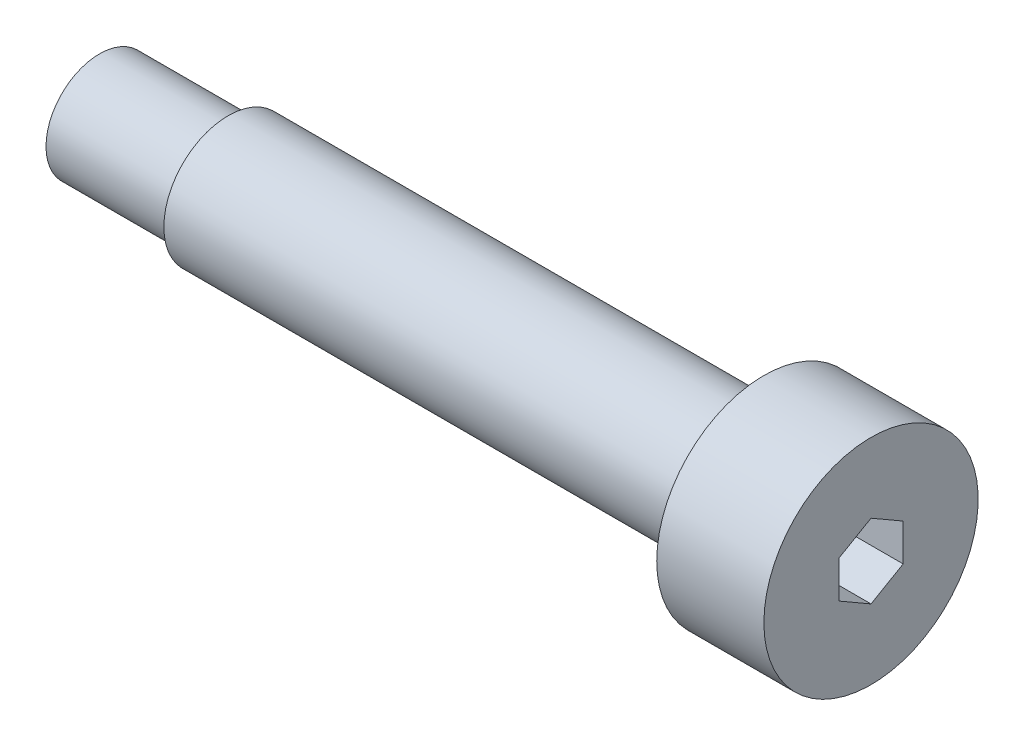
ISO-10303-21;
HEADER;
FILE_DESCRIPTION(('STEP AP214'),'2;1');
FILE_NAME('part.step','',(''),(''),'','','');
FILE_SCHEMA(('AUTOMOTIVE_DESIGN { 1 0 10303 214 1 1 1 1 }'));
ENDSEC;
DATA;
#1=APPLICATION_CONTEXT('core data for automotive mechanical design processes');
#2=APPLICATION_PROTOCOL_DEFINITION('international standard','automotive_design',2000,#1);
#3=PRODUCT_CONTEXT('',#1,'mechanical');
#4=PRODUCT('Part','Part','',(#3));
#5=PRODUCT_RELATED_PRODUCT_CATEGORY('part','',(#4));
#6=PRODUCT_DEFINITION_FORMATION('','',#4);
#7=PRODUCT_DEFINITION_CONTEXT('part definition',#1,'design');
#8=PRODUCT_DEFINITION('design','',#6,#7);
#9=PRODUCT_DEFINITION_SHAPE('','',#8);
#10=(LENGTH_UNIT() NAMED_UNIT(*) SI_UNIT(.MILLI.,.METRE.));
#11=(NAMED_UNIT(*) PLANE_ANGLE_UNIT() SI_UNIT($,.RADIAN.));
#12=(NAMED_UNIT(*) SI_UNIT($,.STERADIAN.) SOLID_ANGLE_UNIT());
#13=UNCERTAINTY_MEASURE_WITH_UNIT(LENGTH_MEASURE(1.E-05),#10,'distance_accuracy_value','');
#14=(GEOMETRIC_REPRESENTATION_CONTEXT(3) GLOBAL_UNCERTAINTY_ASSIGNED_CONTEXT((#13)) GLOBAL_UNIT_ASSIGNED_CONTEXT((#10,
#11,#12)) REPRESENTATION_CONTEXT('',''));
#15=CARTESIAN_POINT('',(0.,0.,0.));
#16=DIRECTION('',(0.,0.,1.));
#17=DIRECTION('',(1.,0.,0.));
#18=AXIS2_PLACEMENT_3D('',#15,#16,#17);
#19=CARTESIAN_POINT('',(-6.,2.5,0.));
#20=DIRECTION('',(1.,0.,0.));
#21=DIRECTION('',(0.,0.,-1.));
#22=AXIS2_PLACEMENT_3D('',#19,#20,#21);
#23=PLANE('',#22);
#24=CARTESIAN_POINT('',(-6.,0.,0.));
#25=DIRECTION('',(-1.,0.,0.));
#26=DIRECTION('',(0.,0.,1.));
#27=AXIS2_PLACEMENT_3D('',#24,#25,#26);
#28=CIRCLE('',#27,2.5);
#29=CARTESIAN_POINT('',(-6.,0.,2.5));
#30=VERTEX_POINT('',#29);
#31=EDGE_CURVE('E11',#30,#30,#28,.T.);
#32=ORIENTED_EDGE('',*,*,#31,.T.);
#33=EDGE_LOOP('',(#32));
#34=FACE_BOUND('',#33,.T.);
#35=ADVANCED_FACE('F36',(#34),#23,.F.);
#36=CARTESIAN_POINT('',(0.,0.,0.));
#37=DIRECTION('',(-1.,0.,0.));
#38=DIRECTION('',(0.,0.,1.));
#39=AXIS2_PLACEMENT_3D('',#36,#37,#38);
#40=CYLINDRICAL_SURFACE('',#39,2.5);
#41=ORIENTED_EDGE('',*,*,#31,.F.);
#42=EDGE_LOOP('',(#41));
#43=FACE_BOUND('',#42,.T.);
#44=CARTESIAN_POINT('',(0.,0.,0.));
#45=DIRECTION('',(-1.,0.,0.));
#46=DIRECTION('',(0.,0.,1.));
#47=AXIS2_PLACEMENT_3D('',#44,#45,#46);
#48=CIRCLE('',#47,2.5);
#49=CARTESIAN_POINT('',(0.,0.,2.5));
#50=VERTEX_POINT('',#49);
#51=EDGE_CURVE('E43',#50,#50,#48,.T.);
#52=ORIENTED_EDGE('',*,*,#51,.T.);
#53=EDGE_LOOP('',(#52));
#54=FACE_BOUND('',#53,.T.);
#55=ADVANCED_FACE('F156',(#43,#54),#40,.T.);
#56=CARTESIAN_POINT('',(0.,3.,0.));
#57=DIRECTION('',(1.,0.,0.));
#58=DIRECTION('',(0.,0.,-1.));
#59=AXIS2_PLACEMENT_3D('',#56,#57,#58);
#60=PLANE('',#59);
#61=ORIENTED_EDGE('',*,*,#51,.F.);
#62=EDGE_LOOP('',(#61));
#63=FACE_BOUND('',#62,.T.);
#64=CARTESIAN_POINT('',(0.,0.,0.));
#65=DIRECTION('',(-1.,0.,0.));
#66=DIRECTION('',(0.,0.,1.));
#67=AXIS2_PLACEMENT_3D('',#64,#65,#66);
#68=CIRCLE('',#67,3.);
#69=CARTESIAN_POINT('',(0.,0.,3.));
#70=VERTEX_POINT('',#69);
#71=EDGE_CURVE('E151',#70,#70,#68,.T.);
#72=ORIENTED_EDGE('',*,*,#71,.T.);
#73=EDGE_LOOP('',(#72));
#74=FACE_BOUND('',#73,.T.);
#75=ADVANCED_FACE('F158',(#63,#74),#60,.F.);
#76=CARTESIAN_POINT('',(0.,0.,0.));
#77=DIRECTION('',(-1.,0.,0.));
#78=DIRECTION('',(0.,0.,1.));
#79=AXIS2_PLACEMENT_3D('',#76,#77,#78);
#80=CYLINDRICAL_SURFACE('',#79,3.);
#81=ORIENTED_EDGE('',*,*,#71,.F.);
#82=EDGE_LOOP('',(#81));
#83=FACE_BOUND('',#82,.T.);
#84=CARTESIAN_POINT('',(25.,0.,0.));
#85=DIRECTION('',(-1.,0.,0.));
#86=DIRECTION('',(0.,0.,1.));
#87=AXIS2_PLACEMENT_3D('',#84,#85,#86);
#88=CIRCLE('',#87,3.);
#89=CARTESIAN_POINT('',(25.,0.,3.));
#90=VERTEX_POINT('',#89);
#91=EDGE_CURVE('E148',#90,#90,#88,.T.);
#92=ORIENTED_EDGE('',*,*,#91,.T.);
#93=EDGE_LOOP('',(#92));
#94=FACE_BOUND('',#93,.T.);
#95=ADVANCED_FACE('F161',(#83,#94),#80,.T.);
#96=CARTESIAN_POINT('',(25.,5.,0.));
#97=DIRECTION('',(1.,0.,0.));
#98=DIRECTION('',(0.,0.,-1.));
#99=AXIS2_PLACEMENT_3D('',#96,#97,#98);
#100=PLANE('',#99);
#101=ORIENTED_EDGE('',*,*,#91,.F.);
#102=EDGE_LOOP('',(#101));
#103=FACE_BOUND('',#102,.T.);
#104=CARTESIAN_POINT('',(25.,0.,0.));
#105=DIRECTION('',(-1.,0.,0.));
#106=DIRECTION('',(0.,0.,1.));
#107=AXIS2_PLACEMENT_3D('',#104,#105,#106);
#108=CIRCLE('',#107,5.);
#109=CARTESIAN_POINT('',(25.,0.,5.));
#110=VERTEX_POINT('',#109);
#111=EDGE_CURVE('E145',#110,#110,#108,.T.);
#112=ORIENTED_EDGE('',*,*,#111,.T.);
#113=EDGE_LOOP('',(#112));
#114=FACE_BOUND('',#113,.T.);
#115=ADVANCED_FACE('F167',(#103,#114),#100,.F.);
#116=CARTESIAN_POINT('',(0.,0.,0.));
#117=DIRECTION('',(-1.,0.,0.));
#118=DIRECTION('',(0.,0.,1.));
#119=AXIS2_PLACEMENT_3D('',#116,#117,#118);
#120=CYLINDRICAL_SURFACE('',#119,5.);
#121=ORIENTED_EDGE('',*,*,#111,.F.);
#122=EDGE_LOOP('',(#121));
#123=FACE_BOUND('',#122,.T.);
#124=CARTESIAN_POINT('',(30.,0.,0.));
#125=DIRECTION('',(-1.,0.,0.));
#126=DIRECTION('',(0.,0.,1.));
#127=AXIS2_PLACEMENT_3D('',#124,#125,#126);
#128=CIRCLE('',#127,5.);
#129=CARTESIAN_POINT('',(30.,0.,5.));
#130=VERTEX_POINT('',#129);
#131=EDGE_CURVE('E137',#130,#130,#128,.T.);
#132=ORIENTED_EDGE('',*,*,#131,.T.);
#133=EDGE_LOOP('',(#132));
#134=FACE_BOUND('',#133,.T.);
#135=ADVANCED_FACE('F173',(#123,#134),#120,.T.);
#136=CARTESIAN_POINT('',(30.,0.,0.));
#137=DIRECTION('',(-1.,0.,0.));
#138=DIRECTION('',(0.,0.,1.));
#139=AXIS2_PLACEMENT_3D('',#136,#137,#138);
#140=PLANE('',#139);
#141=DIRECTION('',(0.,-0.5,0.866025403784438));
#142=VECTOR('',#141,1.);
#143=CARTESIAN_POINT('',(30.,1.73205080756888,0.));
#144=LINE('',#143,#142);
#145=CARTESIAN_POINT('',(30.,1.73205080756888,0.));
#146=VERTEX_POINT('',#145);
#147=CARTESIAN_POINT('',(30.,0.866025403784439,1.5));
#148=VERTEX_POINT('',#147);
#149=EDGE_CURVE('E124',#146,#148,#144,.T.);
#150=ORIENTED_EDGE('',*,*,#149,.F.);
#151=DIRECTION('',(0.,0.5,0.866025403784439));
#152=VECTOR('',#151,1.);
#153=CARTESIAN_POINT('',(30.,0.866025403784439,-1.5));
#154=LINE('',#153,#152);
#155=CARTESIAN_POINT('',(30.,0.866025403784439,-1.5));
#156=VERTEX_POINT('',#155);
#157=EDGE_CURVE('E50',#156,#146,#154,.T.);
#158=ORIENTED_EDGE('',*,*,#157,.F.);
#159=DIRECTION('',(0.,1.,0.));
#160=VECTOR('',#159,1.);
#161=CARTESIAN_POINT('',(30.,-0.866025403784439,-1.5));
#162=LINE('',#161,#160);
#163=CARTESIAN_POINT('',(30.,-0.866025403784439,-1.5));
#164=VERTEX_POINT('',#163);
#165=EDGE_CURVE('E133',#164,#156,#162,.T.);
#166=ORIENTED_EDGE('',*,*,#165,.F.);
#167=DIRECTION('',(0.,0.5,-0.866025403784439));
#168=VECTOR('',#167,1.);
#169=CARTESIAN_POINT('',(30.,-1.73205080756888,0.));
#170=LINE('',#169,#168);
#171=CARTESIAN_POINT('',(30.,-1.73205080756888,0.));
#172=VERTEX_POINT('',#171);
#173=EDGE_CURVE('E131',#172,#164,#170,.T.);
#174=ORIENTED_EDGE('',*,*,#173,.F.);
#175=DIRECTION('',(0.,-0.5,-0.866025403784439));
#176=VECTOR('',#175,1.);
#177=CARTESIAN_POINT('',(30.,-0.866025403784439,1.5));
#178=LINE('',#177,#176);
#179=CARTESIAN_POINT('',(30.,-0.866025403784439,1.5));
#180=VERTEX_POINT('',#179);
#181=EDGE_CURVE('E98',#180,#172,#178,.T.);
#182=ORIENTED_EDGE('',*,*,#181,.F.);
#183=DIRECTION('',(0.,-1.,0.));
#184=VECTOR('',#183,1.);
#185=CARTESIAN_POINT('',(30.,0.866025403784439,1.5));
#186=LINE('',#185,#184);
#187=EDGE_CURVE('E127',#148,#180,#186,.T.);
#188=ORIENTED_EDGE('',*,*,#187,.F.);
#189=EDGE_LOOP('',(#150,#158,#166,#174,#182,#188));
#190=FACE_BOUND('',#189,.T.);
#191=ORIENTED_EDGE('',*,*,#131,.F.);
#192=EDGE_LOOP('',(#191));
#193=FACE_BOUND('',#192,.T.);
#194=ADVANCED_FACE('F179',(#190,#193),#140,.F.);
#195=CARTESIAN_POINT('',(27.,0.866025403784439,-1.5));
#196=DIRECTION('',(0.,0.866025403784439,-0.5));
#197=DIRECTION('',(0.,0.5,0.866025403784439));
#198=AXIS2_PLACEMENT_3D('',#195,#196,#197);
#199=PLANE('',#198);
#200=ORIENTED_EDGE('',*,*,#157,.T.);
#201=DIRECTION('',(1.,0.,0.));
#202=VECTOR('',#201,1.);
#203=CARTESIAN_POINT('',(27.,1.73205080756888,0.));
#204=LINE('',#203,#202);
#205=CARTESIAN_POINT('',(27.,1.73205080756888,0.));
#206=VERTEX_POINT('',#205);
#207=EDGE_CURVE('E80',#206,#146,#204,.T.);
#208=ORIENTED_EDGE('',*,*,#207,.F.);
#209=DIRECTION('',(0.,0.5,0.866025403784439));
#210=VECTOR('',#209,1.);
#211=CARTESIAN_POINT('',(27.,0.866025403784439,-1.5));
#212=LINE('',#211,#210);
#213=CARTESIAN_POINT('',(27.,0.866025403784439,-1.5));
#214=VERTEX_POINT('',#213);
#215=EDGE_CURVE('E135',#214,#206,#212,.T.);
#216=ORIENTED_EDGE('',*,*,#215,.F.);
#217=DIRECTION('',(1.,0.,0.));
#218=VECTOR('',#217,1.);
#219=CARTESIAN_POINT('',(27.,0.866025403784439,-1.5));
#220=LINE('',#219,#218);
#221=EDGE_CURVE('E58',#214,#156,#220,.T.);
#222=ORIENTED_EDGE('',*,*,#221,.T.);
#223=EDGE_LOOP('',(#200,#208,#216,#222));
#224=FACE_BOUND('',#223,.T.);
#225=ADVANCED_FACE('F184',(#224),#199,.F.);
#226=CARTESIAN_POINT('',(27.,-0.866025403784439,-1.5));
#227=DIRECTION('',(0.,0.,-1.));
#228=DIRECTION('',(-1.,0.,0.));
#229=AXIS2_PLACEMENT_3D('',#226,#227,#228);
#230=PLANE('',#229);
#231=ORIENTED_EDGE('',*,*,#165,.T.);
#232=ORIENTED_EDGE('',*,*,#221,.F.);
#233=DIRECTION('',(0.,1.,0.));
#234=VECTOR('',#233,1.);
#235=CARTESIAN_POINT('',(27.,-0.866025403784439,-1.5));
#236=LINE('',#235,#234);
#237=CARTESIAN_POINT('',(27.,-0.866025403784439,-1.5));
#238=VERTEX_POINT('',#237);
#239=EDGE_CURVE('E110',#238,#214,#236,.T.);
#240=ORIENTED_EDGE('',*,*,#239,.F.);
#241=DIRECTION('',(1.,0.,0.));
#242=VECTOR('',#241,1.);
#243=CARTESIAN_POINT('',(27.,-0.866025403784439,-1.5));
#244=LINE('',#243,#242);
#245=EDGE_CURVE('E102',#238,#164,#244,.T.);
#246=ORIENTED_EDGE('',*,*,#245,.T.);
#247=EDGE_LOOP('',(#231,#232,#240,#246));
#248=FACE_BOUND('',#247,.T.);
#249=ADVANCED_FACE('F190',(#248),#230,.F.);
#250=CARTESIAN_POINT('',(27.,-1.73205080756888,0.));
#251=DIRECTION('',(0.,-0.866025403784439,-0.5));
#252=DIRECTION('',(0.,0.5,-0.866025403784439));
#253=AXIS2_PLACEMENT_3D('',#250,#251,#252);
#254=PLANE('',#253);
#255=ORIENTED_EDGE('',*,*,#173,.T.);
#256=ORIENTED_EDGE('',*,*,#245,.F.);
#257=DIRECTION('',(0.,0.5,-0.866025403784439));
#258=VECTOR('',#257,1.);
#259=CARTESIAN_POINT('',(27.,-1.73205080756888,0.));
#260=LINE('',#259,#258);
#261=CARTESIAN_POINT('',(27.,-1.73205080756888,0.));
#262=VERTEX_POINT('',#261);
#263=EDGE_CURVE('E106',#262,#238,#260,.T.);
#264=ORIENTED_EDGE('',*,*,#263,.F.);
#265=DIRECTION('',(1.,0.,0.));
#266=VECTOR('',#265,1.);
#267=CARTESIAN_POINT('',(27.,-1.73205080756888,0.));
#268=LINE('',#267,#266);
#269=EDGE_CURVE('E91',#262,#172,#268,.T.);
#270=ORIENTED_EDGE('',*,*,#269,.T.);
#271=EDGE_LOOP('',(#255,#256,#264,#270));
#272=FACE_BOUND('',#271,.T.);
#273=ADVANCED_FACE('F107',(#272),#254,.F.);
#274=CARTESIAN_POINT('',(27.,-0.866025403784439,1.5));
#275=DIRECTION('',(0.,-0.866025403784438,0.5));
#276=DIRECTION('',(0.,-0.5,-0.866025403784439));
#277=AXIS2_PLACEMENT_3D('',#274,#275,#276);
#278=PLANE('',#277);
#279=ORIENTED_EDGE('',*,*,#181,.T.);
#280=ORIENTED_EDGE('',*,*,#269,.F.);
#281=DIRECTION('',(0.,-0.5,-0.866025403784439));
#282=VECTOR('',#281,1.);
#283=CARTESIAN_POINT('',(27.,-0.866025403784439,1.5));
#284=LINE('',#283,#282);
#285=CARTESIAN_POINT('',(27.,-0.866025403784439,1.5));
#286=VERTEX_POINT('',#285);
#287=EDGE_CURVE('E95',#286,#262,#284,.T.);
#288=ORIENTED_EDGE('',*,*,#287,.F.);
#289=DIRECTION('',(1.,0.,0.));
#290=VECTOR('',#289,1.);
#291=CARTESIAN_POINT('',(27.,-0.866025403784439,1.5));
#292=LINE('',#291,#290);
#293=EDGE_CURVE('E103',#286,#180,#292,.T.);
#294=ORIENTED_EDGE('',*,*,#293,.T.);
#295=EDGE_LOOP('',(#279,#280,#288,#294));
#296=FACE_BOUND('',#295,.T.);
#297=ADVANCED_FACE('F93',(#296),#278,.F.);
#298=CARTESIAN_POINT('',(27.,0.866025403784439,1.5));
#299=DIRECTION('',(0.,0.,1.));
#300=DIRECTION('',(0.,-1.,0.));
#301=AXIS2_PLACEMENT_3D('',#298,#299,#300);
#302=PLANE('',#301);
#303=ORIENTED_EDGE('',*,*,#187,.T.);
#304=ORIENTED_EDGE('',*,*,#293,.F.);
#305=DIRECTION('',(0.,-1.,0.));
#306=VECTOR('',#305,1.);
#307=CARTESIAN_POINT('',(27.,0.866025403784439,1.5));
#308=LINE('',#307,#306);
#309=CARTESIAN_POINT('',(27.,0.866025403784439,1.5));
#310=VERTEX_POINT('',#309);
#311=EDGE_CURVE('E116',#310,#286,#308,.T.);
#312=ORIENTED_EDGE('',*,*,#311,.F.);
#313=DIRECTION('',(1.,0.,0.));
#314=VECTOR('',#313,1.);
#315=CARTESIAN_POINT('',(27.,0.866025403784439,1.5));
#316=LINE('',#315,#314);
#317=EDGE_CURVE('E140',#310,#148,#316,.T.);
#318=ORIENTED_EDGE('',*,*,#317,.T.);
#319=EDGE_LOOP('',(#303,#304,#312,#318));
#320=FACE_BOUND('',#319,.T.);
#321=ADVANCED_FACE('F253',(#320),#302,.F.);
#322=CARTESIAN_POINT('',(27.,1.73205080756888,0.));
#323=DIRECTION('',(0.,0.866025403784439,0.5));
#324=DIRECTION('',(0.,-0.5,0.866025403784439));
#325=AXIS2_PLACEMENT_3D('',#322,#323,#324);
#326=PLANE('',#325);
#327=ORIENTED_EDGE('',*,*,#149,.T.);
#328=ORIENTED_EDGE('',*,*,#317,.F.);
#329=DIRECTION('',(0.,-0.5,0.866025403784438));
#330=VECTOR('',#329,1.);
#331=CARTESIAN_POINT('',(27.,1.73205080756888,0.));
#332=LINE('',#331,#330);
#333=EDGE_CURVE('E118',#206,#310,#332,.T.);
#334=ORIENTED_EDGE('',*,*,#333,.F.);
#335=ORIENTED_EDGE('',*,*,#207,.T.);
#336=EDGE_LOOP('',(#327,#328,#334,#335));
#337=FACE_BOUND('',#336,.T.);
#338=ADVANCED_FACE('F262',(#337),#326,.F.);
#339=CARTESIAN_POINT('',(27.,0.866025403784438,-1.5));
#340=DIRECTION('',(-1.,0.,0.));
#341=DIRECTION('',(0.,0.,1.));
#342=AXIS2_PLACEMENT_3D('',#339,#340,#341);
#343=PLANE('',#342);
#344=ORIENTED_EDGE('',*,*,#215,.T.);
#345=ORIENTED_EDGE('',*,*,#333,.T.);
#346=ORIENTED_EDGE('',*,*,#311,.T.);
#347=ORIENTED_EDGE('',*,*,#287,.T.);
#348=ORIENTED_EDGE('',*,*,#263,.T.);
#349=ORIENTED_EDGE('',*,*,#239,.T.);
#350=EDGE_LOOP('',(#344,#345,#346,#347,#348,#349));
#351=FACE_BOUND('',#350,.T.);
#352=ADVANCED_FACE('F113',(#351),#343,.F.);
#353=CLOSED_SHELL('',(#35,#55,#75,#95,#115,#135,#194,#225,#249,#273,#297,#321,#338,#352));
#354=MANIFOLD_SOLID_BREP('B2',#353);
#355=ADVANCED_BREP_SHAPE_REPRESENTATION('',(#18,#354),#14);
#356=SHAPE_DEFINITION_REPRESENTATION(#9,#355);
ENDSEC;
END-ISO-10303-21;
